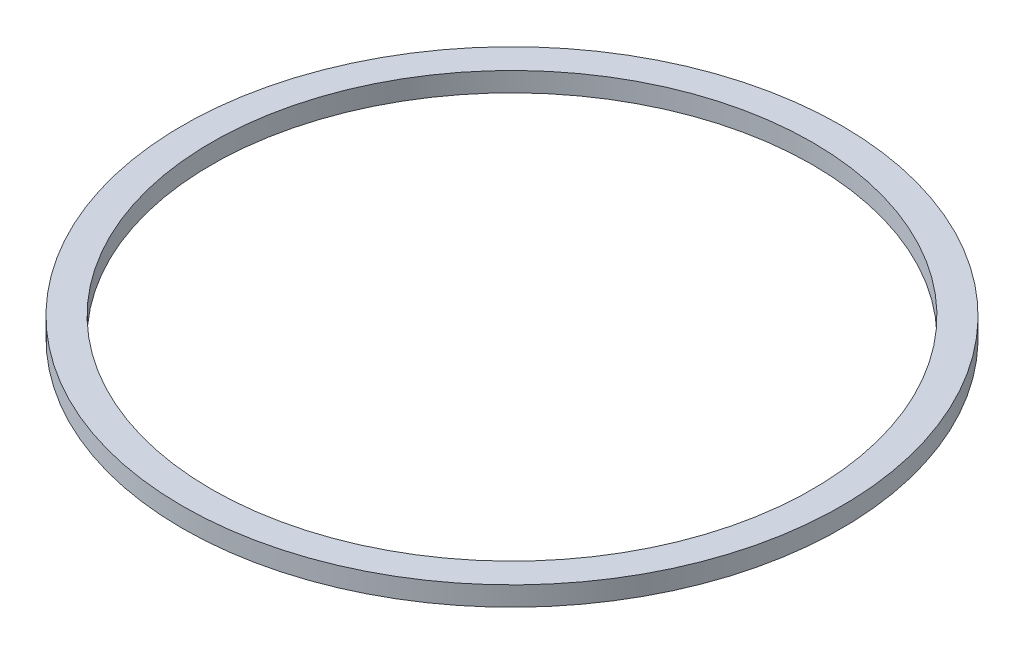
ISO-10303-21;
HEADER;
FILE_DESCRIPTION(('STEP AP214'),'2;1');
FILE_NAME('part.step','',(''),(''),'','','');
FILE_SCHEMA(('AUTOMOTIVE_DESIGN { 1 0 10303 214 1 1 1 1 }'));
ENDSEC;
DATA;
#1=APPLICATION_CONTEXT('core data for automotive mechanical design processes');
#2=APPLICATION_PROTOCOL_DEFINITION('international standard','automotive_design',2000,#1);
#3=PRODUCT_CONTEXT('',#1,'mechanical');
#4=PRODUCT('Part','Part','',(#3));
#5=PRODUCT_RELATED_PRODUCT_CATEGORY('part','',(#4));
#6=PRODUCT_DEFINITION_FORMATION('','',#4);
#7=PRODUCT_DEFINITION_CONTEXT('part definition',#1,'design');
#8=PRODUCT_DEFINITION('design','',#6,#7);
#9=PRODUCT_DEFINITION_SHAPE('','',#8);
#10=(LENGTH_UNIT() NAMED_UNIT(*) SI_UNIT(.MILLI.,.METRE.));
#11=(NAMED_UNIT(*) PLANE_ANGLE_UNIT() SI_UNIT($,.RADIAN.));
#12=(NAMED_UNIT(*) SI_UNIT($,.STERADIAN.) SOLID_ANGLE_UNIT());
#13=UNCERTAINTY_MEASURE_WITH_UNIT(LENGTH_MEASURE(1.E-05),#10,'distance_accuracy_value','');
#14=(GEOMETRIC_REPRESENTATION_CONTEXT(3) GLOBAL_UNCERTAINTY_ASSIGNED_CONTEXT((#13)) GLOBAL_UNIT_ASSIGNED_CONTEXT((#10,
#11,#12)) REPRESENTATION_CONTEXT('',''));
#15=CARTESIAN_POINT('',(0.,0.,0.));
#16=DIRECTION('',(0.,0.,1.));
#17=DIRECTION('',(1.,0.,0.));
#18=AXIS2_PLACEMENT_3D('',#15,#16,#17);
#19=CARTESIAN_POINT('',(0.,1.,0.));
#20=DIRECTION('',(0.,1.,0.));
#21=DIRECTION('',(0.,0.,1.));
#22=AXIS2_PLACEMENT_3D('',#19,#20,#21);
#23=PLANE('',#22);
#24=CARTESIAN_POINT('',(0.,1.,0.));
#25=DIRECTION('',(0.,1.,0.));
#26=DIRECTION('',(0.,0.,1.));
#27=AXIS2_PLACEMENT_3D('',#24,#25,#26);
#28=CIRCLE('',#27,17.);
#29=CARTESIAN_POINT('',(0.,1.,17.));
#30=VERTEX_POINT('',#29);
#31=EDGE_CURVE('E10',#30,#30,#28,.T.);
#32=ORIENTED_EDGE('',*,*,#31,.T.);
#33=EDGE_LOOP('',(#32));
#34=FACE_BOUND('',#33,.T.);
#35=CARTESIAN_POINT('',(0.,1.,0.));
#36=DIRECTION('',(0.,1.,0.));
#37=DIRECTION('',(0.,0.,1.));
#38=AXIS2_PLACEMENT_3D('',#35,#36,#37);
#39=CIRCLE('',#38,15.5);
#40=CARTESIAN_POINT('',(0.,1.,15.5));
#41=VERTEX_POINT('',#40);
#42=EDGE_CURVE('E56',#41,#41,#39,.T.);
#43=ORIENTED_EDGE('',*,*,#42,.F.);
#44=EDGE_LOOP('',(#43));
#45=FACE_BOUND('',#44,.T.);
#46=ADVANCED_FACE('F43',(#34,#45),#23,.T.);
#47=CARTESIAN_POINT('',(0.,0.,0.));
#48=DIRECTION('',(0.,1.,0.));
#49=DIRECTION('',(0.,0.,1.));
#50=AXIS2_PLACEMENT_3D('',#47,#48,#49);
#51=PLANE('',#50);
#52=CARTESIAN_POINT('',(0.,0.,0.));
#53=DIRECTION('',(0.,1.,0.));
#54=DIRECTION('',(0.,0.,1.));
#55=AXIS2_PLACEMENT_3D('',#52,#53,#54);
#56=CIRCLE('',#55,17.);
#57=CARTESIAN_POINT('',(0.,0.,17.));
#58=VERTEX_POINT('',#57);
#59=EDGE_CURVE('E47',#58,#58,#56,.T.);
#60=ORIENTED_EDGE('',*,*,#59,.F.);
#61=EDGE_LOOP('',(#60));
#62=FACE_BOUND('',#61,.T.);
#63=CARTESIAN_POINT('',(0.,0.,0.));
#64=DIRECTION('',(0.,1.,0.));
#65=DIRECTION('',(0.,0.,1.));
#66=AXIS2_PLACEMENT_3D('',#63,#64,#65);
#67=CIRCLE('',#66,15.5);
#68=CARTESIAN_POINT('',(0.,0.,15.5));
#69=VERTEX_POINT('',#68);
#70=EDGE_CURVE('E58',#69,#69,#67,.T.);
#71=ORIENTED_EDGE('',*,*,#70,.T.);
#72=EDGE_LOOP('',(#71));
#73=FACE_BOUND('',#72,.T.);
#74=ADVANCED_FACE('F70',(#62,#73),#51,.F.);
#75=CARTESIAN_POINT('',(0.,1.,0.));
#76=DIRECTION('',(0.,-1.,0.));
#77=DIRECTION('',(0.,0.,-1.));
#78=AXIS2_PLACEMENT_3D('',#75,#76,#77);
#79=CYLINDRICAL_SURFACE('',#78,17.);
#80=ORIENTED_EDGE('',*,*,#31,.F.);
#81=EDGE_LOOP('',(#80));
#82=FACE_BOUND('',#81,.T.);
#83=ORIENTED_EDGE('',*,*,#59,.T.);
#84=EDGE_LOOP('',(#83));
#85=FACE_BOUND('',#84,.T.);
#86=ADVANCED_FACE('F45',(#82,#85),#79,.T.);
#87=CARTESIAN_POINT('',(0.,1.,0.));
#88=DIRECTION('',(0.,-1.,0.));
#89=DIRECTION('',(0.,0.,-1.));
#90=AXIS2_PLACEMENT_3D('',#87,#88,#89);
#91=CYLINDRICAL_SURFACE('',#90,15.5);
#92=ORIENTED_EDGE('',*,*,#42,.T.);
#93=EDGE_LOOP('',(#92));
#94=FACE_BOUND('',#93,.T.);
#95=ORIENTED_EDGE('',*,*,#70,.F.);
#96=EDGE_LOOP('',(#95));
#97=FACE_BOUND('',#96,.T.);
#98=ADVANCED_FACE('F66',(#94,#97),#91,.F.);
#99=CLOSED_SHELL('',(#46,#74,#86,#98));
#100=MANIFOLD_SOLID_BREP('B2',#99);
#101=ADVANCED_BREP_SHAPE_REPRESENTATION('',(#18,#100),#14);
#102=SHAPE_DEFINITION_REPRESENTATION(#9,#101);
ENDSEC;
END-ISO-10303-21;
